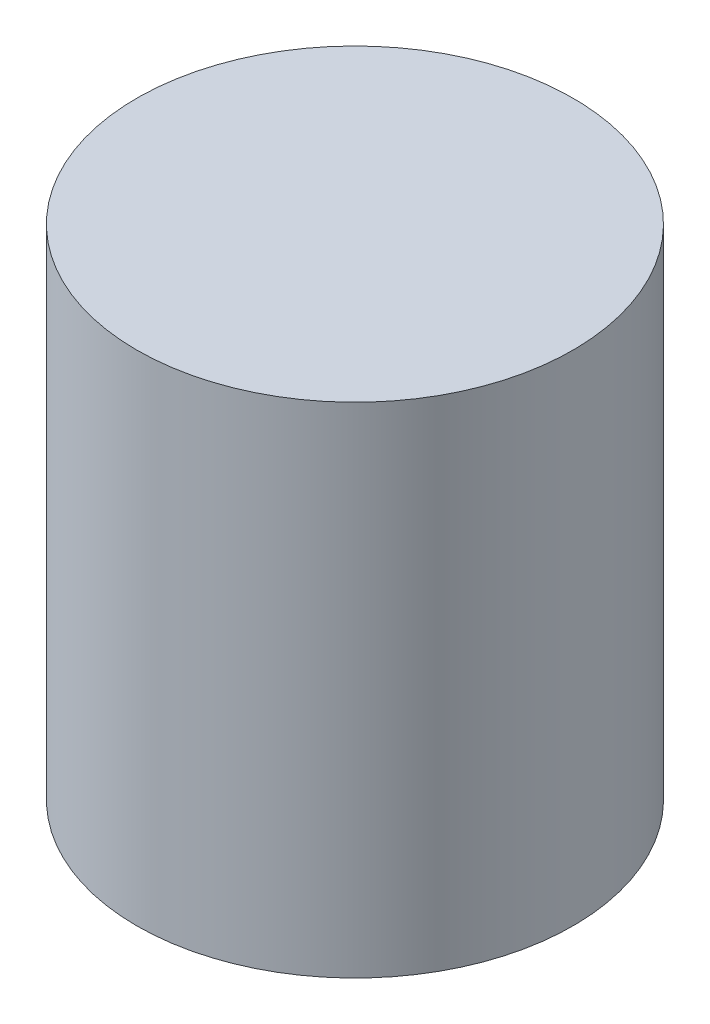
ISO-10303-21;
HEADER;
FILE_DESCRIPTION(('STEP AP214'),'2;1');
FILE_NAME('part.step','',(''),(''),'','','');
FILE_SCHEMA(('AUTOMOTIVE_DESIGN { 1 0 10303 214 1 1 1 1 }'));
ENDSEC;
DATA;
#1=APPLICATION_CONTEXT('core data for automotive mechanical design processes');
#2=APPLICATION_PROTOCOL_DEFINITION('international standard','automotive_design',2000,#1);
#3=PRODUCT_CONTEXT('',#1,'mechanical');
#4=PRODUCT('Part','Part','',(#3));
#5=PRODUCT_RELATED_PRODUCT_CATEGORY('part','',(#4));
#6=PRODUCT_DEFINITION_FORMATION('','',#4);
#7=PRODUCT_DEFINITION_CONTEXT('part definition',#1,'design');
#8=PRODUCT_DEFINITION('design','',#6,#7);
#9=PRODUCT_DEFINITION_SHAPE('','',#8);
#10=(LENGTH_UNIT() NAMED_UNIT(*) SI_UNIT(.MILLI.,.METRE.));
#11=(NAMED_UNIT(*) PLANE_ANGLE_UNIT() SI_UNIT($,.RADIAN.));
#12=(NAMED_UNIT(*) SI_UNIT($,.STERADIAN.) SOLID_ANGLE_UNIT());
#13=UNCERTAINTY_MEASURE_WITH_UNIT(LENGTH_MEASURE(1.E-05),#10,'distance_accuracy_value','');
#14=(GEOMETRIC_REPRESENTATION_CONTEXT(3) GLOBAL_UNCERTAINTY_ASSIGNED_CONTEXT((#13)) GLOBAL_UNIT_ASSIGNED_CONTEXT((#10,
#11,#12)) REPRESENTATION_CONTEXT('',''));
#15=CARTESIAN_POINT('',(0.,0.,0.));
#16=DIRECTION('',(0.,0.,1.));
#17=DIRECTION('',(1.,0.,0.));
#18=AXIS2_PLACEMENT_3D('',#15,#16,#17);
#19=CARTESIAN_POINT('',(0.,40.,0.));
#20=DIRECTION('',(0.,-1.,0.));
#21=DIRECTION('',(0.,0.,-1.));
#22=AXIS2_PLACEMENT_3D('',#19,#20,#21);
#23=CYLINDRICAL_SURFACE('',#22,17.5);
#24=CARTESIAN_POINT('',(0.,40.,0.));
#25=DIRECTION('',(0.,1.,0.));
#26=DIRECTION('',(0.,0.,1.));
#27=AXIS2_PLACEMENT_3D('',#24,#25,#26);
#28=CIRCLE('',#27,17.5);
#29=CARTESIAN_POINT('',(0.,40.,17.5));
#30=VERTEX_POINT('',#29);
#31=EDGE_CURVE('E10',#30,#30,#28,.T.);
#32=ORIENTED_EDGE('',*,*,#31,.F.);
#33=EDGE_LOOP('',(#32));
#34=FACE_BOUND('',#33,.T.);
#35=CARTESIAN_POINT('',(0.,0.,0.));
#36=DIRECTION('',(0.,1.,0.));
#37=DIRECTION('',(0.,0.,1.));
#38=AXIS2_PLACEMENT_3D('',#35,#36,#37);
#39=CIRCLE('',#38,17.5);
#40=CARTESIAN_POINT('',(0.,0.,17.5));
#41=VERTEX_POINT('',#40);
#42=EDGE_CURVE('E35',#41,#41,#39,.T.);
#43=ORIENTED_EDGE('',*,*,#42,.T.);
#44=EDGE_LOOP('',(#43));
#45=FACE_BOUND('',#44,.T.);
#46=ADVANCED_FACE('F32',(#34,#45),#23,.T.);
#47=CARTESIAN_POINT('',(0.,40.,0.));
#48=DIRECTION('',(0.,1.,0.));
#49=DIRECTION('',(0.,0.,1.));
#50=AXIS2_PLACEMENT_3D('',#47,#48,#49);
#51=PLANE('',#50);
#52=ORIENTED_EDGE('',*,*,#31,.T.);
#53=EDGE_LOOP('',(#52));
#54=FACE_BOUND('',#53,.T.);
#55=ADVANCED_FACE('F61',(#54),#51,.T.);
#56=CARTESIAN_POINT('',(0.,0.,0.));
#57=DIRECTION('',(0.,1.,0.));
#58=DIRECTION('',(0.,0.,1.));
#59=AXIS2_PLACEMENT_3D('',#56,#57,#58);
#60=PLANE('',#59);
#61=CARTESIAN_POINT('',(0.,0.,0.));
#62=DIRECTION('',(0.,-1.,0.));
#63=DIRECTION('',(0.,0.,-1.));
#64=AXIS2_PLACEMENT_3D('',#61,#62,#63);
#65=CIRCLE('',#64,12.);
#66=CARTESIAN_POINT('',(0.,0.,-12.));
#67=VERTEX_POINT('',#66);
#68=EDGE_CURVE('E44',#67,#67,#65,.T.);
#69=ORIENTED_EDGE('',*,*,#68,.F.);
#70=EDGE_LOOP('',(#69));
#71=FACE_BOUND('',#70,.T.);
#72=ORIENTED_EDGE('',*,*,#42,.F.);
#73=EDGE_LOOP('',(#72));
#74=FACE_BOUND('',#73,.T.);
#75=ADVANCED_FACE('F55',(#71,#74),#60,.F.);
#76=CARTESIAN_POINT('',(0.,20.,0.));
#77=DIRECTION('',(0.,-1.,0.));
#78=DIRECTION('',(0.,0.,-1.));
#79=AXIS2_PLACEMENT_3D('',#76,#77,#78);
#80=CYLINDRICAL_SURFACE('',#79,12.);
#81=CARTESIAN_POINT('',(0.,20.,0.));
#82=DIRECTION('',(0.,-1.,0.));
#83=DIRECTION('',(0.,0.,-1.));
#84=AXIS2_PLACEMENT_3D('',#81,#82,#83);
#85=CIRCLE('',#84,12.);
#86=CARTESIAN_POINT('',(0.,20.,-12.));
#87=VERTEX_POINT('',#86);
#88=EDGE_CURVE('E42',#87,#87,#85,.T.);
#89=ORIENTED_EDGE('',*,*,#88,.F.);
#90=EDGE_LOOP('',(#89));
#91=FACE_BOUND('',#90,.T.);
#92=ORIENTED_EDGE('',*,*,#68,.T.);
#93=EDGE_LOOP('',(#92));
#94=FACE_BOUND('',#93,.T.);
#95=ADVANCED_FACE('F52',(#91,#94),#80,.F.);
#96=CARTESIAN_POINT('',(0.,20.,0.));
#97=DIRECTION('',(0.,-1.,0.));
#98=DIRECTION('',(0.,0.,-1.));
#99=AXIS2_PLACEMENT_3D('',#96,#97,#98);
#100=PLANE('',#99);
#101=ORIENTED_EDGE('',*,*,#88,.T.);
#102=EDGE_LOOP('',(#101));
#103=FACE_BOUND('',#102,.T.);
#104=ADVANCED_FACE('F50',(#103),#100,.T.);
#105=CLOSED_SHELL('',(#46,#55,#75,#95,#104));
#106=MANIFOLD_SOLID_BREP('B2',#105);
#107=ADVANCED_BREP_SHAPE_REPRESENTATION('',(#18,#106),#14);
#108=SHAPE_DEFINITION_REPRESENTATION(#9,#107);
ENDSEC;
END-ISO-10303-21;
